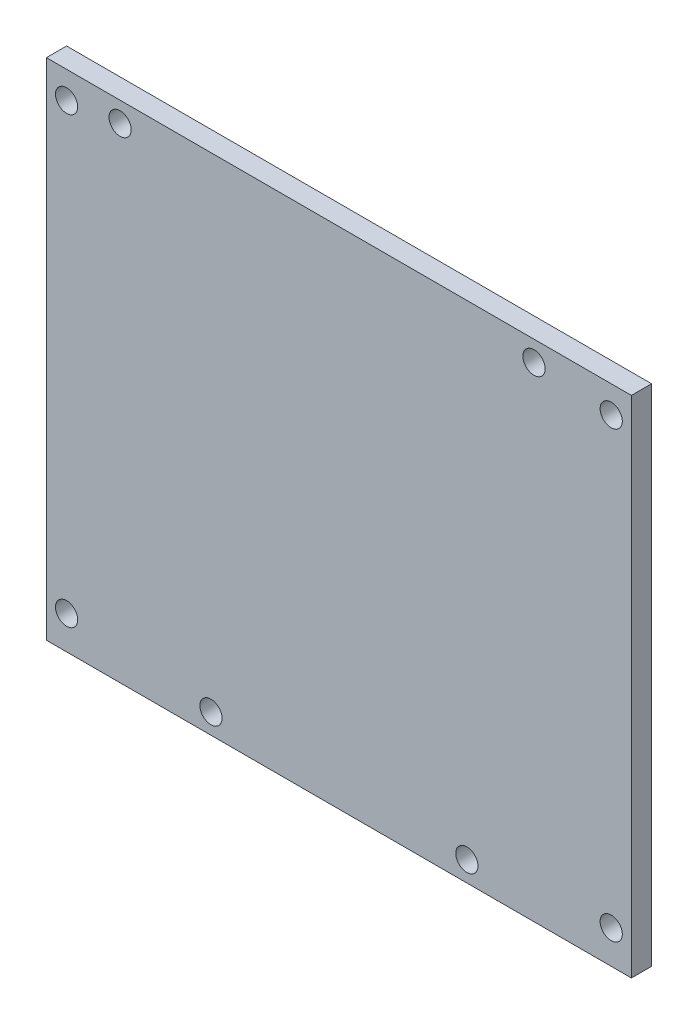
ISO-10303-21;
HEADER;
FILE_DESCRIPTION(('STEP AP214'),'2;1');
FILE_NAME('part.step','',(''),(''),'','','');
FILE_SCHEMA(('AUTOMOTIVE_DESIGN { 1 0 10303 214 1 1 1 1 }'));
ENDSEC;
DATA;
#1=APPLICATION_CONTEXT('core data for automotive mechanical design processes');
#2=APPLICATION_PROTOCOL_DEFINITION('international standard','automotive_design',2000,#1);
#3=PRODUCT_CONTEXT('',#1,'mechanical');
#4=PRODUCT('Part','Part','',(#3));
#5=PRODUCT_RELATED_PRODUCT_CATEGORY('part','',(#4));
#6=PRODUCT_DEFINITION_FORMATION('','',#4);
#7=PRODUCT_DEFINITION_CONTEXT('part definition',#1,'design');
#8=PRODUCT_DEFINITION('design','',#6,#7);
#9=PRODUCT_DEFINITION_SHAPE('','',#8);
#10=(LENGTH_UNIT() NAMED_UNIT(*) SI_UNIT(.MILLI.,.METRE.));
#11=(NAMED_UNIT(*) PLANE_ANGLE_UNIT() SI_UNIT($,.RADIAN.));
#12=(NAMED_UNIT(*) SI_UNIT($,.STERADIAN.) SOLID_ANGLE_UNIT());
#13=UNCERTAINTY_MEASURE_WITH_UNIT(LENGTH_MEASURE(1.E-05),#10,'distance_accuracy_value','');
#14=(GEOMETRIC_REPRESENTATION_CONTEXT(3) GLOBAL_UNCERTAINTY_ASSIGNED_CONTEXT((#13)) GLOBAL_UNIT_ASSIGNED_CONTEXT((#10,
#11,#12)) REPRESENTATION_CONTEXT('',''));
#15=CARTESIAN_POINT('',(0.,0.,0.));
#16=DIRECTION('',(0.,0.,1.));
#17=DIRECTION('',(1.,0.,0.));
#18=AXIS2_PLACEMENT_3D('',#15,#16,#17);
#19=CARTESIAN_POINT('',(-4.3,-4.3,13.1));
#20=DIRECTION('',(1.,0.,0.));
#21=DIRECTION('',(0.,0.,-1.));
#22=AXIS2_PLACEMENT_3D('',#19,#20,#21);
#23=PLANE('',#22);
#24=DIRECTION('',(0.,-1.,0.));
#25=VECTOR('',#24,1.);
#26=CARTESIAN_POINT('',(-4.3,-4.3,11.1));
#27=LINE('',#26,#25);
#28=CARTESIAN_POINT('',(-4.3,45.68,11.1));
#29=VERTEX_POINT('',#28);
#30=CARTESIAN_POINT('',(-4.3,-4.3,11.1));
#31=VERTEX_POINT('',#30);
#32=EDGE_CURVE('E115',#29,#31,#27,.T.);
#33=ORIENTED_EDGE('',*,*,#32,.T.);
#34=DIRECTION('',(0.,0.,-1.));
#35=VECTOR('',#34,1.);
#36=CARTESIAN_POINT('',(-4.3,-4.3,13.1));
#37=LINE('',#36,#35);
#38=CARTESIAN_POINT('',(-4.3,-4.3,13.1));
#39=VERTEX_POINT('',#38);
#40=EDGE_CURVE('E11',#39,#31,#37,.T.);
#41=ORIENTED_EDGE('',*,*,#40,.F.);
#42=DIRECTION('',(0.,-1.,0.));
#43=VECTOR('',#42,1.);
#44=CARTESIAN_POINT('',(-4.3,-4.3,13.1));
#45=LINE('',#44,#43);
#46=CARTESIAN_POINT('',(-4.3,45.68,13.1));
#47=VERTEX_POINT('',#46);
#48=EDGE_CURVE('E97',#47,#39,#45,.T.);
#49=ORIENTED_EDGE('',*,*,#48,.F.);
#50=DIRECTION('',(0.,0.,-1.));
#51=VECTOR('',#50,1.);
#52=CARTESIAN_POINT('',(-4.3,45.68,13.1));
#53=LINE('',#52,#51);
#54=EDGE_CURVE('E111',#47,#29,#53,.T.);
#55=ORIENTED_EDGE('',*,*,#54,.T.);
#56=EDGE_LOOP('',(#33,#41,#49,#55));
#57=FACE_BOUND('',#56,.T.);
#58=ADVANCED_FACE('F45',(#57),#23,.F.);
#59=CARTESIAN_POINT('',(-4.3,-4.3,13.1));
#60=DIRECTION('',(0.,1.,0.));
#61=DIRECTION('',(0.,0.,1.));
#62=AXIS2_PLACEMENT_3D('',#59,#60,#61);
#63=PLANE('',#62);
#64=DIRECTION('',(1.,0.,0.));
#65=VECTOR('',#64,1.);
#66=CARTESIAN_POINT('',(-4.3,-4.3,11.1));
#67=LINE('',#66,#65);
#68=CARTESIAN_POINT('',(53.65,-4.3,11.1));
#69=VERTEX_POINT('',#68);
#70=EDGE_CURVE('E102',#31,#69,#67,.T.);
#71=ORIENTED_EDGE('',*,*,#70,.T.);
#72=DIRECTION('',(0.,0.,-1.));
#73=VECTOR('',#72,1.);
#74=CARTESIAN_POINT('',(53.65,-4.3,13.1));
#75=LINE('',#74,#73);
#76=CARTESIAN_POINT('',(53.65,-4.3,13.1));
#77=VERTEX_POINT('',#76);
#78=EDGE_CURVE('E54',#77,#69,#75,.T.);
#79=ORIENTED_EDGE('',*,*,#78,.F.);
#80=DIRECTION('',(1.,0.,0.));
#81=VECTOR('',#80,1.);
#82=CARTESIAN_POINT('',(-4.3,-4.3,13.1));
#83=LINE('',#82,#81);
#84=EDGE_CURVE('E92',#39,#77,#83,.T.);
#85=ORIENTED_EDGE('',*,*,#84,.F.);
#86=ORIENTED_EDGE('',*,*,#40,.T.);
#87=EDGE_LOOP('',(#71,#79,#85,#86));
#88=FACE_BOUND('',#87,.T.);
#89=ADVANCED_FACE('F101',(#88),#63,.F.);
#90=CARTESIAN_POINT('',(53.65,-4.3,13.1));
#91=DIRECTION('',(-1.,0.,0.));
#92=DIRECTION('',(0.,0.,1.));
#93=AXIS2_PLACEMENT_3D('',#90,#91,#92);
#94=PLANE('',#93);
#95=DIRECTION('',(0.,1.,0.));
#96=VECTOR('',#95,1.);
#97=CARTESIAN_POINT('',(53.65,-4.3,11.1));
#98=LINE('',#97,#96);
#99=CARTESIAN_POINT('',(53.65,45.68,11.1));
#100=VERTEX_POINT('',#99);
#101=EDGE_CURVE('E79',#69,#100,#98,.T.);
#102=ORIENTED_EDGE('',*,*,#101,.T.);
#103=DIRECTION('',(0.,0.,-1.));
#104=VECTOR('',#103,1.);
#105=CARTESIAN_POINT('',(53.65,45.68,13.1));
#106=LINE('',#105,#104);
#107=CARTESIAN_POINT('',(53.65,45.68,13.1));
#108=VERTEX_POINT('',#107);
#109=EDGE_CURVE('E104',#108,#100,#106,.T.);
#110=ORIENTED_EDGE('',*,*,#109,.F.);
#111=DIRECTION('',(0.,1.,0.));
#112=VECTOR('',#111,1.);
#113=CARTESIAN_POINT('',(53.65,-4.3,13.1));
#114=LINE('',#113,#112);
#115=EDGE_CURVE('E95',#77,#108,#114,.T.);
#116=ORIENTED_EDGE('',*,*,#115,.F.);
#117=ORIENTED_EDGE('',*,*,#78,.T.);
#118=EDGE_LOOP('',(#102,#110,#116,#117));
#119=FACE_BOUND('',#118,.T.);
#120=ADVANCED_FACE('F105',(#119),#94,.F.);
#121=CARTESIAN_POINT('',(-4.3,45.68,13.1));
#122=DIRECTION('',(0.,-1.,0.));
#123=DIRECTION('',(0.,0.,-1.));
#124=AXIS2_PLACEMENT_3D('',#121,#122,#123);
#125=PLANE('',#124);
#126=DIRECTION('',(-1.,0.,0.));
#127=VECTOR('',#126,1.);
#128=CARTESIAN_POINT('',(-4.3,45.68,11.1));
#129=LINE('',#128,#127);
#130=EDGE_CURVE('E85',#100,#29,#129,.T.);
#131=ORIENTED_EDGE('',*,*,#130,.T.);
#132=ORIENTED_EDGE('',*,*,#54,.F.);
#133=DIRECTION('',(-1.,0.,0.));
#134=VECTOR('',#133,1.);
#135=CARTESIAN_POINT('',(-4.3,45.68,13.1));
#136=LINE('',#135,#134);
#137=EDGE_CURVE('E62',#108,#47,#136,.T.);
#138=ORIENTED_EDGE('',*,*,#137,.F.);
#139=ORIENTED_EDGE('',*,*,#109,.T.);
#140=EDGE_LOOP('',(#131,#132,#138,#139));
#141=FACE_BOUND('',#140,.T.);
#142=ADVANCED_FACE('F129',(#141),#125,.F.);
#143=CARTESIAN_POINT('',(0.,0.,13.1));
#144=DIRECTION('',(0.,0.,-1.));
#145=DIRECTION('',(-1.,0.,0.));
#146=AXIS2_PLACEMENT_3D('',#143,#144,#145);
#147=PLANE('',#146);
#148=CARTESIAN_POINT('',(12.,-2.3,13.1));
#149=DIRECTION('',(0.,0.,1.));
#150=DIRECTION('',(1.,0.,0.));
#151=AXIS2_PLACEMENT_3D('',#148,#149,#150);
#152=CIRCLE('',#151,1.1);
#153=CARTESIAN_POINT('',(13.1,-2.3,13.1));
#154=VERTEX_POINT('',#153);
#155=EDGE_CURVE('E166',#154,#154,#152,.T.);
#156=ORIENTED_EDGE('',*,*,#155,.F.);
#157=EDGE_LOOP('',(#156));
#158=FACE_BOUND('',#157,.T.);
#159=CARTESIAN_POINT('',(51.65,43.,13.1));
#160=DIRECTION('',(0.,0.,1.));
#161=DIRECTION('',(1.,0.,0.));
#162=AXIS2_PLACEMENT_3D('',#159,#160,#161);
#163=CIRCLE('',#162,1.1);
#164=CARTESIAN_POINT('',(52.75,43.,13.1));
#165=VERTEX_POINT('',#164);
#166=EDGE_CURVE('E151',#165,#165,#163,.T.);
#167=ORIENTED_EDGE('',*,*,#166,.F.);
#168=EDGE_LOOP('',(#167));
#169=FACE_BOUND('',#168,.T.);
#170=CARTESIAN_POINT('',(51.65,-1.,13.1));
#171=DIRECTION('',(0.,0.,1.));
#172=DIRECTION('',(1.,0.,0.));
#173=AXIS2_PLACEMENT_3D('',#170,#171,#172);
#174=CIRCLE('',#173,1.1);
#175=CARTESIAN_POINT('',(52.75,-1.,13.1));
#176=VERTEX_POINT('',#175);
#177=EDGE_CURVE('E150',#176,#176,#174,.T.);
#178=ORIENTED_EDGE('',*,*,#177,.F.);
#179=EDGE_LOOP('',(#178));
#180=FACE_BOUND('',#179,.T.);
#181=CARTESIAN_POINT('',(-2.3,43.,13.1));
#182=DIRECTION('',(0.,0.,1.));
#183=DIRECTION('',(1.,0.,0.));
#184=AXIS2_PLACEMENT_3D('',#181,#182,#183);
#185=CIRCLE('',#184,1.1);
#186=CARTESIAN_POINT('',(-1.2,43.,13.1));
#187=VERTEX_POINT('',#186);
#188=EDGE_CURVE('E142',#187,#187,#185,.T.);
#189=ORIENTED_EDGE('',*,*,#188,.F.);
#190=EDGE_LOOP('',(#189));
#191=FACE_BOUND('',#190,.T.);
#192=CARTESIAN_POINT('',(37.35,-2.3,13.1));
#193=DIRECTION('',(0.,0.,1.));
#194=DIRECTION('',(1.,0.,0.));
#195=AXIS2_PLACEMENT_3D('',#192,#193,#194);
#196=CIRCLE('',#195,1.1);
#197=CARTESIAN_POINT('',(38.45,-2.3,13.1));
#198=VERTEX_POINT('',#197);
#199=EDGE_CURVE('E167',#198,#198,#196,.T.);
#200=ORIENTED_EDGE('',*,*,#199,.F.);
#201=EDGE_LOOP('',(#200));
#202=FACE_BOUND('',#201,.T.);
#203=CARTESIAN_POINT('',(3.,43.68,13.1));
#204=DIRECTION('',(0.,0.,1.));
#205=DIRECTION('',(1.,0.,0.));
#206=AXIS2_PLACEMENT_3D('',#203,#204,#205);
#207=CIRCLE('',#206,1.1);
#208=CARTESIAN_POINT('',(4.1,43.68,13.1));
#209=VERTEX_POINT('',#208);
#210=EDGE_CURVE('E187',#209,#209,#207,.T.);
#211=ORIENTED_EDGE('',*,*,#210,.F.);
#212=EDGE_LOOP('',(#211));
#213=FACE_BOUND('',#212,.T.);
#214=CARTESIAN_POINT('',(44.,43.68,13.1));
#215=DIRECTION('',(0.,0.,1.));
#216=DIRECTION('',(1.,0.,0.));
#217=AXIS2_PLACEMENT_3D('',#214,#215,#216);
#218=CIRCLE('',#217,1.1);
#219=CARTESIAN_POINT('',(45.1,43.68,13.1));
#220=VERTEX_POINT('',#219);
#221=EDGE_CURVE('E180',#220,#220,#218,.T.);
#222=ORIENTED_EDGE('',*,*,#221,.F.);
#223=EDGE_LOOP('',(#222));
#224=FACE_BOUND('',#223,.T.);
#225=CARTESIAN_POINT('',(-2.3,-1.,13.1));
#226=DIRECTION('',(0.,0.,1.));
#227=DIRECTION('',(1.,0.,0.));
#228=AXIS2_PLACEMENT_3D('',#225,#226,#227);
#229=CIRCLE('',#228,1.1);
#230=CARTESIAN_POINT('',(-1.2,-1.,13.1));
#231=VERTEX_POINT('',#230);
#232=EDGE_CURVE('E138',#231,#231,#229,.T.);
#233=ORIENTED_EDGE('',*,*,#232,.F.);
#234=EDGE_LOOP('',(#233));
#235=FACE_BOUND('',#234,.T.);
#236=ORIENTED_EDGE('',*,*,#48,.T.);
#237=ORIENTED_EDGE('',*,*,#84,.T.);
#238=ORIENTED_EDGE('',*,*,#115,.T.);
#239=ORIENTED_EDGE('',*,*,#137,.T.);
#240=EDGE_LOOP('',(#236,#237,#238,#239));
#241=FACE_BOUND('',#240,.T.);
#242=ADVANCED_FACE('F93',(#158,#169,#180,#191,#202,#213,#224,#235,#241),#147,.F.);
#243=CARTESIAN_POINT('',(0.,0.,11.1));
#244=DIRECTION('',(0.,0.,-1.));
#245=DIRECTION('',(-1.,0.,0.));
#246=AXIS2_PLACEMENT_3D('',#243,#244,#245);
#247=PLANE('',#246);
#248=CARTESIAN_POINT('',(12.,-2.3,11.1));
#249=DIRECTION('',(0.,0.,1.));
#250=DIRECTION('',(1.,0.,0.));
#251=AXIS2_PLACEMENT_3D('',#248,#249,#250);
#252=CIRCLE('',#251,1.1);
#253=CARTESIAN_POINT('',(13.1,-2.3,11.1));
#254=VERTEX_POINT('',#253);
#255=EDGE_CURVE('E162',#254,#254,#252,.T.);
#256=ORIENTED_EDGE('',*,*,#255,.T.);
#257=EDGE_LOOP('',(#256));
#258=FACE_BOUND('',#257,.T.);
#259=CARTESIAN_POINT('',(51.65,43.,11.1));
#260=DIRECTION('',(0.,0.,1.));
#261=DIRECTION('',(1.,0.,0.));
#262=AXIS2_PLACEMENT_3D('',#259,#260,#261);
#263=CIRCLE('',#262,1.1);
#264=CARTESIAN_POINT('',(52.75,43.,11.1));
#265=VERTEX_POINT('',#264);
#266=EDGE_CURVE('E171',#265,#265,#263,.T.);
#267=ORIENTED_EDGE('',*,*,#266,.T.);
#268=EDGE_LOOP('',(#267));
#269=FACE_BOUND('',#268,.T.);
#270=CARTESIAN_POINT('',(51.65,-1.,11.1));
#271=DIRECTION('',(0.,0.,1.));
#272=DIRECTION('',(1.,0.,0.));
#273=AXIS2_PLACEMENT_3D('',#270,#271,#272);
#274=CIRCLE('',#273,1.1);
#275=CARTESIAN_POINT('',(52.75,-1.,11.1));
#276=VERTEX_POINT('',#275);
#277=EDGE_CURVE('E146',#276,#276,#274,.T.);
#278=ORIENTED_EDGE('',*,*,#277,.T.);
#279=EDGE_LOOP('',(#278));
#280=FACE_BOUND('',#279,.T.);
#281=CARTESIAN_POINT('',(-2.3,43.,11.1));
#282=DIRECTION('',(0.,0.,1.));
#283=DIRECTION('',(1.,0.,0.));
#284=AXIS2_PLACEMENT_3D('',#281,#282,#283);
#285=CIRCLE('',#284,1.1);
#286=CARTESIAN_POINT('',(-1.2,43.,11.1));
#287=VERTEX_POINT('',#286);
#288=EDGE_CURVE('E155',#287,#287,#285,.T.);
#289=ORIENTED_EDGE('',*,*,#288,.T.);
#290=EDGE_LOOP('',(#289));
#291=FACE_BOUND('',#290,.T.);
#292=CARTESIAN_POINT('',(37.35,-2.3,11.1));
#293=DIRECTION('',(0.,0.,1.));
#294=DIRECTION('',(1.,0.,0.));
#295=AXIS2_PLACEMENT_3D('',#292,#293,#294);
#296=CIRCLE('',#295,1.1);
#297=CARTESIAN_POINT('',(38.45,-2.3,11.1));
#298=VERTEX_POINT('',#297);
#299=EDGE_CURVE('E191',#298,#298,#296,.T.);
#300=ORIENTED_EDGE('',*,*,#299,.T.);
#301=EDGE_LOOP('',(#300));
#302=FACE_BOUND('',#301,.T.);
#303=CARTESIAN_POINT('',(3.,43.68,11.1));
#304=DIRECTION('',(0.,0.,1.));
#305=DIRECTION('',(1.,0.,0.));
#306=AXIS2_PLACEMENT_3D('',#303,#304,#305);
#307=CIRCLE('',#306,1.1);
#308=CARTESIAN_POINT('',(4.1,43.68,11.1));
#309=VERTEX_POINT('',#308);
#310=EDGE_CURVE('E184',#309,#309,#307,.T.);
#311=ORIENTED_EDGE('',*,*,#310,.T.);
#312=EDGE_LOOP('',(#311));
#313=FACE_BOUND('',#312,.T.);
#314=CARTESIAN_POINT('',(44.,43.68,11.1));
#315=DIRECTION('',(0.,0.,1.));
#316=DIRECTION('',(1.,0.,0.));
#317=AXIS2_PLACEMENT_3D('',#314,#315,#316);
#318=CIRCLE('',#317,1.1);
#319=CARTESIAN_POINT('',(45.1,43.68,11.1));
#320=VERTEX_POINT('',#319);
#321=EDGE_CURVE('E176',#320,#320,#318,.T.);
#322=ORIENTED_EDGE('',*,*,#321,.T.);
#323=EDGE_LOOP('',(#322));
#324=FACE_BOUND('',#323,.T.);
#325=CARTESIAN_POINT('',(-2.3,-1.,11.1));
#326=DIRECTION('',(0.,0.,1.));
#327=DIRECTION('',(1.,0.,0.));
#328=AXIS2_PLACEMENT_3D('',#325,#326,#327);
#329=CIRCLE('',#328,1.1);
#330=CARTESIAN_POINT('',(-1.2,-1.,11.1));
#331=VERTEX_POINT('',#330);
#332=EDGE_CURVE('E119',#331,#331,#329,.T.);
#333=ORIENTED_EDGE('',*,*,#332,.T.);
#334=EDGE_LOOP('',(#333));
#335=FACE_BOUND('',#334,.T.);
#336=ORIENTED_EDGE('',*,*,#32,.F.);
#337=ORIENTED_EDGE('',*,*,#130,.F.);
#338=ORIENTED_EDGE('',*,*,#101,.F.);
#339=ORIENTED_EDGE('',*,*,#70,.F.);
#340=EDGE_LOOP('',(#336,#337,#338,#339));
#341=FACE_BOUND('',#340,.T.);
#342=ADVANCED_FACE('F132',(#258,#269,#280,#291,#302,#313,#324,#335,#341),#247,.T.);
#343=CARTESIAN_POINT('',(-2.3,-1.,11.1));
#344=DIRECTION('',(0.,0.,1.));
#345=DIRECTION('',(1.,0.,0.));
#346=AXIS2_PLACEMENT_3D('',#343,#344,#345);
#347=CYLINDRICAL_SURFACE('',#346,1.1);
#348=ORIENTED_EDGE('',*,*,#332,.F.);
#349=EDGE_LOOP('',(#348));
#350=FACE_BOUND('',#349,.T.);
#351=ORIENTED_EDGE('',*,*,#232,.T.);
#352=EDGE_LOOP('',(#351));
#353=FACE_BOUND('',#352,.T.);
#354=ADVANCED_FACE('F210',(#350,#353),#347,.F.);
#355=CARTESIAN_POINT('',(44.,43.68,11.1));
#356=DIRECTION('',(0.,0.,1.));
#357=DIRECTION('',(1.,0.,0.));
#358=AXIS2_PLACEMENT_3D('',#355,#356,#357);
#359=CYLINDRICAL_SURFACE('',#358,1.1);
#360=ORIENTED_EDGE('',*,*,#321,.F.);
#361=EDGE_LOOP('',(#360));
#362=FACE_BOUND('',#361,.T.);
#363=ORIENTED_EDGE('',*,*,#221,.T.);
#364=EDGE_LOOP('',(#363));
#365=FACE_BOUND('',#364,.T.);
#366=ADVANCED_FACE('F212',(#362,#365),#359,.F.);
#367=CARTESIAN_POINT('',(3.,43.68,11.1));
#368=DIRECTION('',(0.,0.,1.));
#369=DIRECTION('',(1.,0.,0.));
#370=AXIS2_PLACEMENT_3D('',#367,#368,#369);
#371=CYLINDRICAL_SURFACE('',#370,1.1);
#372=ORIENTED_EDGE('',*,*,#310,.F.);
#373=EDGE_LOOP('',(#372));
#374=FACE_BOUND('',#373,.T.);
#375=ORIENTED_EDGE('',*,*,#210,.T.);
#376=EDGE_LOOP('',(#375));
#377=FACE_BOUND('',#376,.T.);
#378=ADVANCED_FACE('F218',(#374,#377),#371,.F.);
#379=CARTESIAN_POINT('',(37.35,-2.3,11.1));
#380=DIRECTION('',(0.,0.,1.));
#381=DIRECTION('',(1.,0.,0.));
#382=AXIS2_PLACEMENT_3D('',#379,#380,#381);
#383=CYLINDRICAL_SURFACE('',#382,1.1);
#384=ORIENTED_EDGE('',*,*,#299,.F.);
#385=EDGE_LOOP('',(#384));
#386=FACE_BOUND('',#385,.T.);
#387=ORIENTED_EDGE('',*,*,#199,.T.);
#388=EDGE_LOOP('',(#387));
#389=FACE_BOUND('',#388,.T.);
#390=ADVANCED_FACE('F198',(#386,#389),#383,.F.);
#391=CARTESIAN_POINT('',(-2.3,43.,11.1));
#392=DIRECTION('',(0.,0.,1.));
#393=DIRECTION('',(1.,0.,0.));
#394=AXIS2_PLACEMENT_3D('',#391,#392,#393);
#395=CYLINDRICAL_SURFACE('',#394,1.1);
#396=ORIENTED_EDGE('',*,*,#288,.F.);
#397=EDGE_LOOP('',(#396));
#398=FACE_BOUND('',#397,.T.);
#399=ORIENTED_EDGE('',*,*,#188,.T.);
#400=EDGE_LOOP('',(#399));
#401=FACE_BOUND('',#400,.T.);
#402=ADVANCED_FACE('F271',(#398,#401),#395,.F.);
#403=CARTESIAN_POINT('',(51.65,-1.,11.1));
#404=DIRECTION('',(0.,0.,1.));
#405=DIRECTION('',(1.,0.,0.));
#406=AXIS2_PLACEMENT_3D('',#403,#404,#405);
#407=CYLINDRICAL_SURFACE('',#406,1.1);
#408=ORIENTED_EDGE('',*,*,#277,.F.);
#409=EDGE_LOOP('',(#408));
#410=FACE_BOUND('',#409,.T.);
#411=ORIENTED_EDGE('',*,*,#177,.T.);
#412=EDGE_LOOP('',(#411));
#413=FACE_BOUND('',#412,.T.);
#414=ADVANCED_FACE('F281',(#410,#413),#407,.F.);
#415=CARTESIAN_POINT('',(51.65,43.,11.1));
#416=DIRECTION('',(0.,0.,1.));
#417=DIRECTION('',(1.,0.,0.));
#418=AXIS2_PLACEMENT_3D('',#415,#416,#417);
#419=CYLINDRICAL_SURFACE('',#418,1.1);
#420=ORIENTED_EDGE('',*,*,#266,.F.);
#421=EDGE_LOOP('',(#420));
#422=FACE_BOUND('',#421,.T.);
#423=ORIENTED_EDGE('',*,*,#166,.T.);
#424=EDGE_LOOP('',(#423));
#425=FACE_BOUND('',#424,.T.);
#426=ADVANCED_FACE('F291',(#422,#425),#419,.F.);
#427=CARTESIAN_POINT('',(12.,-2.3,11.1));
#428=DIRECTION('',(0.,0.,1.));
#429=DIRECTION('',(1.,0.,0.));
#430=AXIS2_PLACEMENT_3D('',#427,#428,#429);
#431=CYLINDRICAL_SURFACE('',#430,1.1);
#432=ORIENTED_EDGE('',*,*,#255,.F.);
#433=EDGE_LOOP('',(#432));
#434=FACE_BOUND('',#433,.T.);
#435=ORIENTED_EDGE('',*,*,#155,.T.);
#436=EDGE_LOOP('',(#435));
#437=FACE_BOUND('',#436,.T.);
#438=ADVANCED_FACE('F300',(#434,#437),#431,.F.);
#439=CLOSED_SHELL('',(#58,#89,#120,#142,#242,#342,#354,#366,#378,#390,#402,#414,#426,#438));
#440=MANIFOLD_SOLID_BREP('B2',#439);
#441=ADVANCED_BREP_SHAPE_REPRESENTATION('',(#18,#440),#14);
#442=SHAPE_DEFINITION_REPRESENTATION(#9,#441);
ENDSEC;
END-ISO-10303-21;
